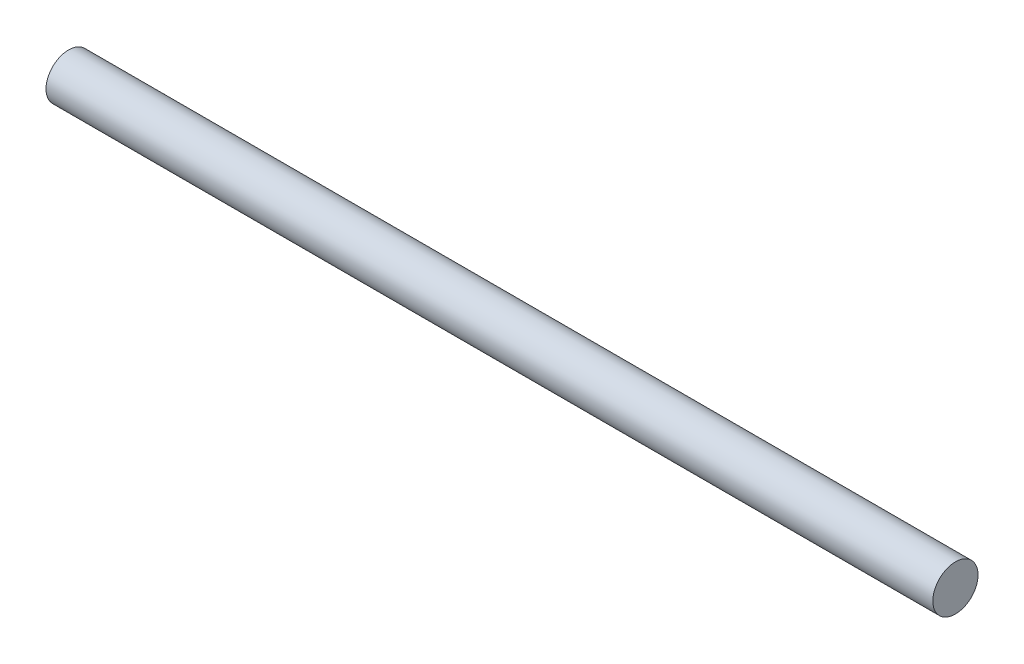
ISO-10303-21;
HEADER;
FILE_DESCRIPTION(('STEP AP214'),'2;1');
FILE_NAME('part.step','',(''),(''),'','','');
FILE_SCHEMA(('AUTOMOTIVE_DESIGN { 1 0 10303 214 1 1 1 1 }'));
ENDSEC;
DATA;
#1=APPLICATION_CONTEXT('core data for automotive mechanical design processes');
#2=APPLICATION_PROTOCOL_DEFINITION('international standard','automotive_design',2000,#1);
#3=PRODUCT_CONTEXT('',#1,'mechanical');
#4=PRODUCT('Part','Part','',(#3));
#5=PRODUCT_RELATED_PRODUCT_CATEGORY('part','',(#4));
#6=PRODUCT_DEFINITION_FORMATION('','',#4);
#7=PRODUCT_DEFINITION_CONTEXT('part definition',#1,'design');
#8=PRODUCT_DEFINITION('design','',#6,#7);
#9=PRODUCT_DEFINITION_SHAPE('','',#8);
#10=(LENGTH_UNIT() NAMED_UNIT(*) SI_UNIT(.MILLI.,.METRE.));
#11=(NAMED_UNIT(*) PLANE_ANGLE_UNIT() SI_UNIT($,.RADIAN.));
#12=(NAMED_UNIT(*) SI_UNIT($,.STERADIAN.) SOLID_ANGLE_UNIT());
#13=UNCERTAINTY_MEASURE_WITH_UNIT(LENGTH_MEASURE(1.E-05),#10,'distance_accuracy_value','');
#14=(GEOMETRIC_REPRESENTATION_CONTEXT(3) GLOBAL_UNCERTAINTY_ASSIGNED_CONTEXT((#13)) GLOBAL_UNIT_ASSIGNED_CONTEXT((#10,
#11,#12)) REPRESENTATION_CONTEXT('',''));
#15=CARTESIAN_POINT('',(0.,0.,0.));
#16=DIRECTION('',(0.,0.,1.));
#17=DIRECTION('',(1.,0.,0.));
#18=AXIS2_PLACEMENT_3D('',#15,#16,#17);
#19=CARTESIAN_POINT('',(24.5,0.,0.));
#20=DIRECTION('',(1.,0.,0.));
#21=DIRECTION('',(0.,0.,-1.));
#22=AXIS2_PLACEMENT_3D('',#19,#20,#21);
#23=PLANE('',#22);
#24=CARTESIAN_POINT('',(24.5,0.,0.));
#25=DIRECTION('',(-1.,0.,0.));
#26=DIRECTION('',(0.,0.,1.));
#27=AXIS2_PLACEMENT_3D('',#24,#25,#26);
#28=CIRCLE('',#27,1.25000000000001);
#29=CARTESIAN_POINT('',(24.5,0.,1.25000000000001));
#30=VERTEX_POINT('',#29);
#31=EDGE_CURVE('E10',#30,#30,#28,.T.);
#32=ORIENTED_EDGE('',*,*,#31,.F.);
#33=EDGE_LOOP('',(#32));
#34=FACE_BOUND('',#33,.T.);
#35=ADVANCED_FACE('F33',(#34),#23,.T.);
#36=CARTESIAN_POINT('',(-24.5,0.,0.));
#37=DIRECTION('',(-1.,0.,0.));
#38=DIRECTION('',(0.,0.,1.));
#39=AXIS2_PLACEMENT_3D('',#36,#37,#38);
#40=CYLINDRICAL_SURFACE('',#39,1.25);
#41=ORIENTED_EDGE('',*,*,#31,.T.);
#42=EDGE_LOOP('',(#41));
#43=FACE_BOUND('',#42,.T.);
#44=CARTESIAN_POINT('',(-24.5,0.,0.));
#45=DIRECTION('',(-1.,0.,0.));
#46=DIRECTION('',(0.,0.,1.));
#47=AXIS2_PLACEMENT_3D('',#44,#45,#46);
#48=CIRCLE('',#47,1.24999999999999);
#49=CARTESIAN_POINT('',(-24.5,0.,1.24999999999999));
#50=VERTEX_POINT('',#49);
#51=EDGE_CURVE('E39',#50,#50,#48,.T.);
#52=ORIENTED_EDGE('',*,*,#51,.F.);
#53=EDGE_LOOP('',(#52));
#54=FACE_BOUND('',#53,.T.);
#55=ADVANCED_FACE('F47',(#43,#54),#40,.T.);
#56=CARTESIAN_POINT('',(-24.5,0.,0.));
#57=DIRECTION('',(1.,0.,0.));
#58=DIRECTION('',(0.,0.,-1.));
#59=AXIS2_PLACEMENT_3D('',#56,#57,#58);
#60=PLANE('',#59);
#61=ORIENTED_EDGE('',*,*,#51,.T.);
#62=EDGE_LOOP('',(#61));
#63=FACE_BOUND('',#62,.T.);
#64=ADVANCED_FACE('F45',(#63),#60,.F.);
#65=CLOSED_SHELL('',(#35,#55,#64));
#66=MANIFOLD_SOLID_BREP('B2',#65);
#67=ADVANCED_BREP_SHAPE_REPRESENTATION('',(#18,#66),#14);
#68=SHAPE_DEFINITION_REPRESENTATION(#9,#67);
ENDSEC;
END-ISO-10303-21;
